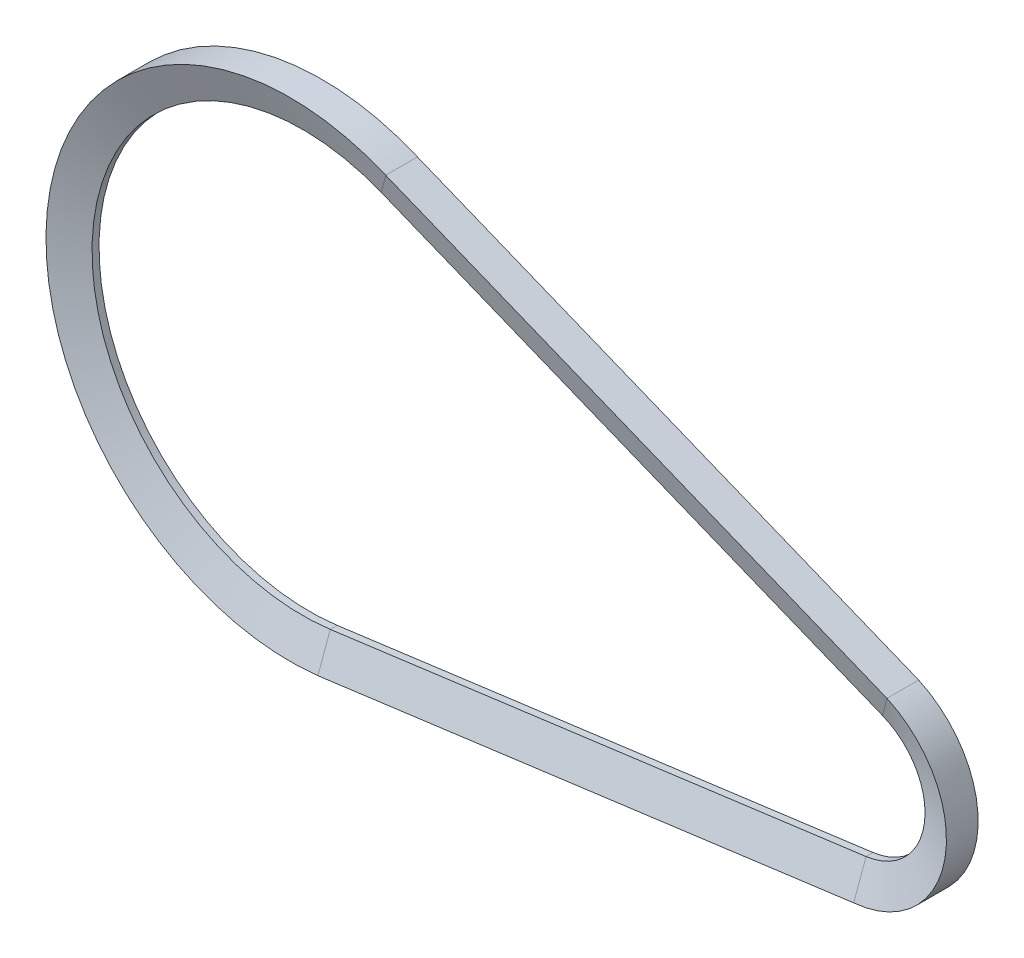
ISO-10303-21;
HEADER;
FILE_DESCRIPTION(('STEP AP214'),'2;1');
FILE_NAME('part.step','',(''),(''),'','','');
FILE_SCHEMA(('AUTOMOTIVE_DESIGN { 1 0 10303 214 1 1 1 1 }'));
ENDSEC;
DATA;
#1=APPLICATION_CONTEXT('core data for automotive mechanical design processes');
#2=APPLICATION_PROTOCOL_DEFINITION('international standard','automotive_design',2000,#1);
#3=PRODUCT_CONTEXT('',#1,'mechanical');
#4=PRODUCT('Part','Part','',(#3));
#5=PRODUCT_RELATED_PRODUCT_CATEGORY('part','',(#4));
#6=PRODUCT_DEFINITION_FORMATION('','',#4);
#7=PRODUCT_DEFINITION_CONTEXT('part definition',#1,'design');
#8=PRODUCT_DEFINITION('design','',#6,#7);
#9=PRODUCT_DEFINITION_SHAPE('','',#8);
#10=(LENGTH_UNIT() NAMED_UNIT(*) SI_UNIT(.MILLI.,.METRE.));
#11=(NAMED_UNIT(*) PLANE_ANGLE_UNIT() SI_UNIT($,.RADIAN.));
#12=(NAMED_UNIT(*) SI_UNIT($,.STERADIAN.) SOLID_ANGLE_UNIT());
#13=UNCERTAINTY_MEASURE_WITH_UNIT(LENGTH_MEASURE(1.E-05),#10,'distance_accuracy_value','');
#14=(GEOMETRIC_REPRESENTATION_CONTEXT(3) GLOBAL_UNCERTAINTY_ASSIGNED_CONTEXT((#13)) GLOBAL_UNIT_ASSIGNED_CONTEXT((#10,
#11,#12)) REPRESENTATION_CONTEXT('',''));
#15=CARTESIAN_POINT('',(0.,0.,0.));
#16=DIRECTION('',(0.,0.,1.));
#17=DIRECTION('',(1.,0.,0.));
#18=AXIS2_PLACEMENT_3D('',#15,#16,#17);
#19=CARTESIAN_POINT('',(124.475719306739,-37.8693151564214,3.49999999999996));
#20=DIRECTION('',(0.131714620449235,-0.991287677094754,0.));
#21=DIRECTION('',(0.991287677094754,0.131714620449235,0.));
#22=AXIS2_PLACEMENT_3D('',#19,#20,#21);
#23=PLANE('',#22);
#24=DIRECTION('',(-0.991287677094754,-0.131714620449235,0.));
#25=VECTOR('',#24,1.);
#26=CARTESIAN_POINT('',(124.475719306739,-37.8693151564214,-3.50000000000004));
#27=LINE('',#26,#25);
#28=CARTESIAN_POINT('',(124.475719306738,-37.8693151564214,-3.50000000000004));
#29=VERTEX_POINT('',#28);
#30=CARTESIAN_POINT('',(6.12472985088943,-53.5948769849061,-3.50000000000004));
#31=VERTEX_POINT('',#30);
#32=EDGE_CURVE('E11',#29,#31,#27,.T.);
#33=ORIENTED_EDGE('',*,*,#32,.F.);
#34=DIRECTION('',(0.,0.,1.));
#35=VECTOR('',#34,1.);
#36=CARTESIAN_POINT('',(124.475719306738,-37.8693151564214,3.49999999999996));
#37=LINE('',#36,#35);
#38=CARTESIAN_POINT('',(124.475719306738,-37.8693151564214,3.49999999999996));
#39=VERTEX_POINT('',#38);
#40=EDGE_CURVE('E35',#29,#39,#37,.T.);
#41=ORIENTED_EDGE('',*,*,#40,.T.);
#42=DIRECTION('',(-0.991287677094754,-0.131714620449235,0.));
#43=VECTOR('',#42,1.);
#44=CARTESIAN_POINT('',(124.475719306739,-37.8693151564214,3.49999999999996));
#45=LINE('',#44,#43);
#46=CARTESIAN_POINT('',(6.12472985088943,-53.5948769849061,3.49999999999996));
#47=VERTEX_POINT('',#46);
#48=EDGE_CURVE('E111',#39,#47,#45,.T.);
#49=ORIENTED_EDGE('',*,*,#48,.T.);
#50=DIRECTION('',(0.,0.,1.));
#51=VECTOR('',#50,1.);
#52=CARTESIAN_POINT('',(6.12472985088943,-53.5948769849061,3.49999999999996));
#53=LINE('',#52,#51);
#54=EDGE_CURVE('E114',#31,#47,#53,.T.);
#55=ORIENTED_EDGE('',*,*,#54,.F.);
#56=EDGE_LOOP('',(#33,#41,#49,#55));
#57=FACE_BOUND('',#56,.T.);
#58=ADVANCED_FACE('F32',(#57),#23,.T.);
#59=CARTESIAN_POINT('',(124.475719306739,-37.8693151564214,-3.50000000000004));
#60=DIRECTION('',(-0.0453981297575221,0.341667511459937,-0.938723772697428));
#61=DIRECTION('',(0.,0.939692620785908,0.342020143325669));
#62=AXIS2_PLACEMENT_3D('',#59,#60,#61);
#63=PLANE('',#62);
#64=DIRECTION('',(-0.991287677094754,-0.131714620449235,0.));
#65=VECTOR('',#64,1.);
#66=CARTESIAN_POINT('',(124.475719306739,-30.3693151564214,-0.770223243003511));
#67=LINE('',#66,#65);
#68=CARTESIAN_POINT('',(124.475719306738,-30.3693151564214,-0.770223243003511));
#69=VERTEX_POINT('',#68);
#70=CARTESIAN_POINT('',(6.12472985088943,-46.0948769849061,-0.770223243003511));
#71=VERTEX_POINT('',#70);
#72=EDGE_CURVE('E40',#69,#71,#67,.T.);
#73=ORIENTED_EDGE('',*,*,#72,.F.);
#74=DIRECTION('',(0.,-0.939692620785908,-0.342020143325669));
#75=VECTOR('',#74,1.);
#76=CARTESIAN_POINT('',(124.475719306738,-37.8693151564214,-3.50000000000004));
#77=LINE('',#76,#75);
#78=EDGE_CURVE('E184',#69,#29,#77,.T.);
#79=ORIENTED_EDGE('',*,*,#78,.T.);
#80=ORIENTED_EDGE('',*,*,#32,.T.);
#81=DIRECTION('',(0.,-0.939692620785908,-0.342020143325669));
#82=VECTOR('',#81,1.);
#83=CARTESIAN_POINT('',(6.12472985088943,-53.5948769849061,-3.50000000000004));
#84=LINE('',#83,#82);
#85=EDGE_CURVE('E138',#71,#31,#84,.T.);
#86=ORIENTED_EDGE('',*,*,#85,.F.);
#87=EDGE_LOOP('',(#73,#79,#80,#86));
#88=FACE_BOUND('',#87,.T.);
#89=ADVANCED_FACE('F223',(#88),#63,.T.);
#90=CARTESIAN_POINT('',(124.475719306739,-30.3693151564214,0.77022324300333));
#91=DIRECTION('',(-0.131714620449235,0.991287677094754,0.));
#92=DIRECTION('',(-0.991287677094754,-0.131714620449235,0.));
#93=AXIS2_PLACEMENT_3D('',#90,#91,#92);
#94=PLANE('',#93);
#95=DIRECTION('',(-0.991287677094754,-0.131714620449235,0.));
#96=VECTOR('',#95,1.);
#97=CARTESIAN_POINT('',(124.475719306739,-30.3693151564214,0.77022324300333));
#98=LINE('',#97,#96);
#99=CARTESIAN_POINT('',(124.475719306738,-30.3693151564214,0.77022324300333));
#100=VERTEX_POINT('',#99);
#101=CARTESIAN_POINT('',(6.12472985088943,-46.0948769849061,0.77022324300333));
#102=VERTEX_POINT('',#101);
#103=EDGE_CURVE('E120',#100,#102,#98,.T.);
#104=ORIENTED_EDGE('',*,*,#103,.F.);
#105=DIRECTION('',(0.,0.,-1.));
#106=VECTOR('',#105,1.);
#107=CARTESIAN_POINT('',(124.475719306738,-30.3693151564214,0.77022324300333));
#108=LINE('',#107,#106);
#109=EDGE_CURVE('E165',#100,#69,#108,.T.);
#110=ORIENTED_EDGE('',*,*,#109,.T.);
#111=ORIENTED_EDGE('',*,*,#72,.T.);
#112=DIRECTION('',(0.,0.,-1.));
#113=VECTOR('',#112,1.);
#114=CARTESIAN_POINT('',(6.12472985088943,-46.0948769849061,0.77022324300333));
#115=LINE('',#114,#113);
#116=EDGE_CURVE('E142',#102,#71,#115,.T.);
#117=ORIENTED_EDGE('',*,*,#116,.F.);
#118=EDGE_LOOP('',(#104,#110,#111,#117));
#119=FACE_BOUND('',#118,.T.);
#120=ADVANCED_FACE('F227',(#119),#94,.T.);
#121=CARTESIAN_POINT('',(122.5,-15.5,0.));
#122=DIRECTION('',(0.,0.,-1.));
#123=DIRECTION('',(-1.,0.,0.));
#124=AXIS2_PLACEMENT_3D('',#121,#122,#123);
#125=CYLINDRICAL_SURFACE('',#124,22.4563961344273);
#126=ORIENTED_EDGE('',*,*,#40,.F.);
#127=CARTESIAN_POINT('',(122.5,-15.5,-3.50000000000004));
#128=DIRECTION('',(0.,0.,-1.));
#129=DIRECTION('',(0.414894040337448,0.90986973534263,0.));
#130=AXIS2_PLACEMENT_3D('',#127,#128,#129);
#131=CIRCLE('',#130,22.4563961344273);
#132=CARTESIAN_POINT('',(131.817024923631,4.93239520758061,-3.50000000000004));
#133=VERTEX_POINT('',#132);
#134=EDGE_CURVE('E193',#133,#29,#131,.T.);
#135=ORIENTED_EDGE('',*,*,#134,.F.);
#136=DIRECTION('',(0.,0.,1.));
#137=VECTOR('',#136,1.);
#138=CARTESIAN_POINT('',(131.817024923631,4.93239520758063,3.49999999999996));
#139=LINE('',#138,#137);
#140=CARTESIAN_POINT('',(131.817024923631,4.93239520758061,3.49999999999996));
#141=VERTEX_POINT('',#140);
#142=EDGE_CURVE('E168',#133,#141,#139,.T.);
#143=ORIENTED_EDGE('',*,*,#142,.T.);
#144=CARTESIAN_POINT('',(122.5,-15.5,3.49999999999996));
#145=DIRECTION('',(0.,0.,-1.));
#146=DIRECTION('',(0.414894040337448,0.90986973534263,0.));
#147=AXIS2_PLACEMENT_3D('',#144,#145,#146);
#148=CIRCLE('',#147,22.4563961344273);
#149=EDGE_CURVE('E162',#141,#39,#148,.T.);
#150=ORIENTED_EDGE('',*,*,#149,.T.);
#151=EDGE_LOOP('',(#126,#135,#143,#150));
#152=FACE_BOUND('',#151,.T.);
#153=ADVANCED_FACE('F200',(#152),#125,.T.);
#154=CARTESIAN_POINT('',(128.117006892717,-1.59139713820364,-0.770223243003511));
#155=CARTESIAN_POINT('',(145.926890042233,-8.78394101937952,-0.770223243003511));
#156=CARTESIAN_POINT('',(143.515788829221,-27.8394183480289,-0.770223243003511));
#157=CARTESIAN_POINT('',(124.475719306739,-30.3693151564214,-0.770223243003511));
#158=CARTESIAN_POINT('',(131.817024923631,4.93239520758063,-3.50000000000004));
#159=CARTESIAN_POINT('',(157.980585327767,-6.9979997314236,-3.50000000000004));
#160=CARTESIAN_POINT('',(153.119494172499,-35.3394183480289,-3.50000000000004));
#161=CARTESIAN_POINT('',(124.475719306739,-37.8693151564214,-3.50000000000004));
#162=(BOUNDED_SURFACE() B_SPLINE_SURFACE(1,3,((#154,#155,#156,#157),(#158,#159,#160,#161)),
.UNSPECIFIED.,.F.,.F.,.F.) B_SPLINE_SURFACE_WITH_KNOTS((2,2),(4,4),(0.,1.),(0.,1.),
.UNSPECIFIED.) GEOMETRIC_REPRESENTATION_ITEM() RATIONAL_B_SPLINE_SURFACE(((1.,0.503405880312619,
0.503405880312619,1.),(1.,0.503405880312619,0.503405880312619,1.))) REPRESENTATION_ITEM('') SURFACE());
#163=CARTESIAN_POINT('',(122.5,-15.5,-0.770223243003511));
#164=DIRECTION('',(0.,0.,-1.));
#165=DIRECTION('',(0.374467126181138,0.927240190786422,0.));
#166=AXIS2_PLACEMENT_3D('',#163,#164,#165);
#167=CIRCLE('',#166,15.);
#168=CARTESIAN_POINT('',(128.117006892717,-1.59139713820367,-0.770223243003511));
#169=VERTEX_POINT('',#168);
#170=EDGE_CURVE('E181',#169,#69,#167,.T.);
#171=DIRECTION('',(0.463583952056587,0.817381270249743,-0.342020143325669));
#172=VECTOR('',#171,1.);
#173=CARTESIAN_POINT('',(131.817024923631,4.93239520758063,-3.50000000000004));
#174=LINE('',#173,#172);
#175=EDGE_CURVE('E177',#169,#133,#174,.T.);
#176=ORIENTED_EDGE('',*,*,#134,.T.);
#177=ORIENTED_EDGE('',*,*,#78,.F.);
#178=ORIENTED_EDGE('',*,*,#170,.F.);
#179=ORIENTED_EDGE('',*,*,#175,.T.);
#180=EDGE_LOOP('',(#176,#177,#178,#179));
#181=FACE_BOUND('',#180,.T.);
#182=ADVANCED_FACE('F236',(#181),#162,.T.);
#183=CARTESIAN_POINT('',(122.5,-15.5,0.));
#184=DIRECTION('',(0.,0.,-1.));
#185=DIRECTION('',(-1.,0.,0.));
#186=AXIS2_PLACEMENT_3D('',#183,#184,#185);
#187=CYLINDRICAL_SURFACE('',#186,15.);
#188=ORIENTED_EDGE('',*,*,#170,.T.);
#189=ORIENTED_EDGE('',*,*,#109,.F.);
#190=CARTESIAN_POINT('',(122.5,-15.5,0.77022324300333));
#191=DIRECTION('',(0.,0.,-1.));
#192=DIRECTION('',(0.374467126181138,0.927240190786422,0.));
#193=AXIS2_PLACEMENT_3D('',#190,#191,#192);
#194=CIRCLE('',#193,15.);
#195=CARTESIAN_POINT('',(128.117006892717,-1.59139713820367,0.77022324300333));
#196=VERTEX_POINT('',#195);
#197=EDGE_CURVE('E161',#196,#100,#194,.T.);
#198=ORIENTED_EDGE('',*,*,#197,.F.);
#199=DIRECTION('',(0.,0.,-1.));
#200=VECTOR('',#199,1.);
#201=CARTESIAN_POINT('',(128.117006892717,-1.59139713820365,0.77022324300333));
#202=LINE('',#201,#200);
#203=EDGE_CURVE('E154',#196,#169,#202,.T.);
#204=ORIENTED_EDGE('',*,*,#203,.T.);
#205=EDGE_LOOP('',(#188,#189,#198,#204));
#206=FACE_BOUND('',#205,.T.);
#207=ADVANCED_FACE('F208',(#206),#187,.F.);
#208=CARTESIAN_POINT('',(131.817024923631,4.93239520758063,3.49999999999996));
#209=CARTESIAN_POINT('',(157.980585327767,-6.9979997314236,3.49999999999996));
#210=CARTESIAN_POINT('',(153.119494172499,-35.3394183480289,3.49999999999996));
#211=CARTESIAN_POINT('',(124.475719306739,-37.8693151564214,3.49999999999996));
#212=CARTESIAN_POINT('',(128.117006892717,-1.59139713820364,0.770223243003331));
#213=CARTESIAN_POINT('',(145.926890042233,-8.78394101937952,0.770223243003331));
#214=CARTESIAN_POINT('',(143.515788829221,-27.8394183480289,0.770223243003331));
#215=CARTESIAN_POINT('',(124.475719306739,-30.3693151564214,0.770223243003331));
#216=(BOUNDED_SURFACE() B_SPLINE_SURFACE(1,3,((#208,#209,#210,#211),(#212,#213,#214,#215)),
.UNSPECIFIED.,.F.,.F.,.F.) B_SPLINE_SURFACE_WITH_KNOTS((2,2),(4,4),(0.,1.),(0.,1.),
.UNSPECIFIED.) GEOMETRIC_REPRESENTATION_ITEM() RATIONAL_B_SPLINE_SURFACE(((1.,0.503405880312619,
0.503405880312619,1.),(1.,0.503405880312619,0.503405880312619,1.))) REPRESENTATION_ITEM('') SURFACE());
#217=DIRECTION('',(0.,0.939692620785904,-0.342020143325681));
#218=VECTOR('',#217,1.);
#219=CARTESIAN_POINT('',(124.475719306738,-37.8693151564214,3.49999999999996));
#220=LINE('',#219,#218);
#221=EDGE_CURVE('E159',#39,#100,#220,.T.);
#222=DIRECTION('',(-0.463583952056585,-0.817381270249739,-0.342020143325681));
#223=VECTOR('',#222,1.);
#224=CARTESIAN_POINT('',(131.817024923631,4.93239520758063,3.49999999999996));
#225=LINE('',#224,#223);
#226=EDGE_CURVE('E151',#141,#196,#225,.T.);
#227=ORIENTED_EDGE('',*,*,#197,.T.);
#228=ORIENTED_EDGE('',*,*,#221,.F.);
#229=ORIENTED_EDGE('',*,*,#149,.F.);
#230=ORIENTED_EDGE('',*,*,#226,.T.);
#231=EDGE_LOOP('',(#227,#228,#229,#230));
#232=FACE_BOUND('',#231,.T.);
#233=ADVANCED_FACE('F205',(#232),#216,.T.);
#234=CARTESIAN_POINT('',(21.1127393983367,49.6404612173529,3.49999999999996));
#235=DIRECTION('',(0.374467126181139,0.927240190786421,0.));
#236=DIRECTION('',(-0.927240190786421,0.374467126181139,0.));
#237=AXIS2_PLACEMENT_3D('',#234,#235,#236);
#238=PLANE('',#237);
#239=ORIENTED_EDGE('',*,*,#142,.F.);
#240=DIRECTION('',(0.927240190786421,-0.374467126181139,0.));
#241=VECTOR('',#240,1.);
#242=CARTESIAN_POINT('',(21.1127393983367,49.6404612173529,-3.50000000000004));
#243=LINE('',#242,#241);
#244=CARTESIAN_POINT('',(21.1127393983366,49.6404612173529,-3.50000000000004));
#245=VERTEX_POINT('',#244);
#246=EDGE_CURVE('E76',#245,#133,#243,.T.);
#247=ORIENTED_EDGE('',*,*,#246,.F.);
#248=DIRECTION('',(0.,0.,1.));
#249=VECTOR('',#248,1.);
#250=CARTESIAN_POINT('',(21.1127393983366,49.6404612173529,3.49999999999996));
#251=LINE('',#250,#249);
#252=CARTESIAN_POINT('',(21.1127393983366,49.6404612173529,3.49999999999996));
#253=VERTEX_POINT('',#252);
#254=EDGE_CURVE('E158',#245,#253,#251,.T.);
#255=ORIENTED_EDGE('',*,*,#254,.T.);
#256=DIRECTION('',(0.927240190786421,-0.374467126181139,0.));
#257=VECTOR('',#256,1.);
#258=CARTESIAN_POINT('',(21.1127393983367,49.6404612173529,3.49999999999996));
#259=LINE('',#258,#257);
#260=EDGE_CURVE('E156',#253,#141,#259,.T.);
#261=ORIENTED_EDGE('',*,*,#260,.T.);
#262=EDGE_LOOP('',(#239,#247,#255,#261));
#263=FACE_BOUND('',#262,.T.);
#264=ADVANCED_FACE('F218',(#263),#238,.T.);
#265=CARTESIAN_POINT('',(21.1127393983367,49.6404612173529,-3.50000000000004));
#266=DIRECTION('',(-0.129067730873885,-0.319592239298412,-0.938723772697428));
#267=DIRECTION('',(0.,0.946641691748173,-0.322287926308383));
#268=AXIS2_PLACEMENT_3D('',#265,#266,#267);
#269=PLANE('',#268);
#270=ORIENTED_EDGE('',*,*,#246,.T.);
#271=ORIENTED_EDGE('',*,*,#175,.F.);
#272=DIRECTION('',(0.927240190786421,-0.374467126181139,0.));
#273=VECTOR('',#272,1.);
#274=CARTESIAN_POINT('',(17.412721367423,43.1166688715686,-0.770223243003511));
#275=LINE('',#274,#273);
#276=CARTESIAN_POINT('',(17.4127213674229,43.1166688715686,-0.770223243003511));
#277=VERTEX_POINT('',#276);
#278=EDGE_CURVE('E86',#277,#169,#275,.T.);
#279=ORIENTED_EDGE('',*,*,#278,.F.);
#280=DIRECTION('',(0.463583952056587,0.817381270249743,-0.342020143325669));
#281=VECTOR('',#280,1.);
#282=CARTESIAN_POINT('',(21.1127393983366,49.6404612173529,-3.50000000000004));
#283=LINE('',#282,#281);
#284=EDGE_CURVE('E174',#277,#245,#283,.T.);
#285=ORIENTED_EDGE('',*,*,#284,.T.);
#286=EDGE_LOOP('',(#270,#271,#279,#285));
#287=FACE_BOUND('',#286,.T.);
#288=ADVANCED_FACE('F211',(#287),#269,.T.);
#289=CARTESIAN_POINT('',(17.412721367423,43.1166688715686,0.77022324300333));
#290=DIRECTION('',(-0.374467126181139,-0.927240190786421,0.));
#291=DIRECTION('',(0.927240190786421,-0.374467126181139,0.));
#292=AXIS2_PLACEMENT_3D('',#289,#290,#291);
#293=PLANE('',#292);
#294=ORIENTED_EDGE('',*,*,#278,.T.);
#295=ORIENTED_EDGE('',*,*,#203,.F.);
#296=DIRECTION('',(0.927240190786421,-0.374467126181139,0.));
#297=VECTOR('',#296,1.);
#298=CARTESIAN_POINT('',(17.412721367423,43.1166688715686,0.77022324300333));
#299=LINE('',#298,#297);
#300=CARTESIAN_POINT('',(17.4127213674229,43.1166688715686,0.77022324300333));
#301=VERTEX_POINT('',#300);
#302=EDGE_CURVE('E94',#301,#196,#299,.T.);
#303=ORIENTED_EDGE('',*,*,#302,.F.);
#304=DIRECTION('',(0.,0.,-1.));
#305=VECTOR('',#304,1.);
#306=CARTESIAN_POINT('',(17.412721367423,43.1166688715686,0.77022324300333));
#307=LINE('',#306,#305);
#308=EDGE_CURVE('E149',#301,#277,#307,.T.);
#309=ORIENTED_EDGE('',*,*,#308,.T.);
#310=EDGE_LOOP('',(#294,#295,#303,#309));
#311=FACE_BOUND('',#310,.T.);
#312=ADVANCED_FACE('F209',(#311),#293,.T.);
#313=CARTESIAN_POINT('',(21.1127393983367,49.6404612173529,3.49999999999996));
#314=DIRECTION('',(-0.129067730873889,-0.319592239298423,0.938723772697424));
#315=DIRECTION('',(0.,-0.946641691748169,-0.322287926308394));
#316=AXIS2_PLACEMENT_3D('',#313,#314,#315);
#317=PLANE('',#316);
#318=ORIENTED_EDGE('',*,*,#302,.T.);
#319=ORIENTED_EDGE('',*,*,#226,.F.);
#320=ORIENTED_EDGE('',*,*,#260,.F.);
#321=DIRECTION('',(-0.463583952056585,-0.81738127024974,-0.342020143325681));
#322=VECTOR('',#321,1.);
#323=CARTESIAN_POINT('',(21.1127393983366,49.6404612173529,3.49999999999996));
#324=LINE('',#323,#322);
#325=EDGE_CURVE('E130',#253,#301,#324,.T.);
#326=ORIENTED_EDGE('',*,*,#325,.T.);
#327=EDGE_LOOP('',(#318,#319,#320,#326));
#328=FACE_BOUND('',#327,.T.);
#329=ADVANCED_FACE('F203',(#328),#317,.T.);
#330=CARTESIAN_POINT('',(0.,0.,0.));
#331=DIRECTION('',(0.,0.,-1.));
#332=DIRECTION('',(-1.,0.,0.));
#333=AXIS2_PLACEMENT_3D('',#330,#331,#332);
#334=CYLINDRICAL_SURFACE('',#333,53.9437035693101);
#335=ORIENTED_EDGE('',*,*,#254,.F.);
#336=CARTESIAN_POINT('',(0.,0.,-3.50000000000004));
#337=DIRECTION('',(0.,0.,-1.));
#338=DIRECTION('',(0.113539290883504,-0.993533506946631,0.));
#339=AXIS2_PLACEMENT_3D('',#336,#337,#338);
#340=CIRCLE('',#339,53.9437035693101);
#341=EDGE_CURVE('E137',#31,#245,#340,.T.);
#342=ORIENTED_EDGE('',*,*,#341,.F.);
#343=ORIENTED_EDGE('',*,*,#54,.T.);
#344=CARTESIAN_POINT('',(0.,0.,3.49999999999996));
#345=DIRECTION('',(0.,0.,-1.));
#346=DIRECTION('',(0.113539290883504,-0.993533506946631,0.));
#347=AXIS2_PLACEMENT_3D('',#344,#345,#346);
#348=CIRCLE('',#347,53.9437035693101);
#349=EDGE_CURVE('E126',#47,#253,#348,.T.);
#350=ORIENTED_EDGE('',*,*,#349,.T.);
#351=EDGE_LOOP('',(#335,#342,#343,#350));
#352=FACE_BOUND('',#351,.T.);
#353=ADVANCED_FACE('F135',(#352),#334,.T.);
#354=CARTESIAN_POINT('',(6.12472985088943,-46.0948769849061,-0.770223243003511));
#355=CARTESIAN_POINT('',(-26.763809279918,-50.4648510588702,-0.770223243003511));
#356=CARTESIAN_POINT('',(-50.2969528979131,-27.0780207687135,-0.770223243003511));
#357=CARTESIAN_POINT('',(-46.1321783681313,5.8371327731105,-0.770223243003511));
#358=CARTESIAN_POINT('',(-41.9674038383495,38.7522863149345,-0.770223243003511));
#359=CARTESIAN_POINT('',(-13.3508763277611,55.5405867888214,-0.770223243003511));
#360=CARTESIAN_POINT('',(17.412721367423,43.1166688715686,-0.770223243003511));
#361=CARTESIAN_POINT('',(6.12472985088943,-53.5948769849061,-3.50000000000004));
#362=CARTESIAN_POINT('',(-32.1150339629089,-57.9648510588702,-3.50000000000004));
#363=CARTESIAN_POINT('',(-58.9139401287493,-30.3388698408813,-3.50000000000004));
#364=CARTESIAN_POINT('',(-53.3840209820255,7.75044892662746,-3.50000000000004));
#365=CARTESIAN_POINT('',(-47.8541018353016,45.8397676941362,-3.50000000000004));
#366=CARTESIAN_POINT('',(-14.3055621138431,64.7043295098772,-3.50000000000004));
#367=CARTESIAN_POINT('',(21.1127393983367,49.6404612173529,-3.50000000000004));
#368=(BOUNDED_SURFACE() B_SPLINE_SURFACE(1,3,((#354,#355,#356,#357,#358,#359,#360),(#361,#362,
#363,#364,#365,#366,#367)),.UNSPECIFIED.,.F.,.F.,.F.) B_SPLINE_SURFACE_WITH_KNOTS((2,2),(4,3,4),
(0.,1.),(0.,0.5,1.),
.UNSPECIFIED.) GEOMETRIC_REPRESENTATION_ITEM() RATIONAL_B_SPLINE_SURFACE(((1.,0.740188803038642,
0.740188803038642,1.,0.740188803038642,0.740188803038642,1.),(1.,0.740188803038642,
0.740188803038642,1.,0.740188803038642,0.740188803038642,1.))) REPRESENTATION_ITEM('') SURFACE());
#369=CARTESIAN_POINT('',(0.,0.,-0.770223243003511));
#370=DIRECTION('',(0.,0.,-1.));
#371=DIRECTION('',(0.131714620449235,-0.991287677094754,0.));
#372=AXIS2_PLACEMENT_3D('',#369,#370,#371);
#373=CIRCLE('',#372,46.5);
#374=EDGE_CURVE('E171',#71,#277,#373,.T.);
#375=ORIENTED_EDGE('',*,*,#341,.T.);
#376=ORIENTED_EDGE('',*,*,#284,.F.);
#377=ORIENTED_EDGE('',*,*,#374,.F.);
#378=ORIENTED_EDGE('',*,*,#85,.T.);
#379=EDGE_LOOP('',(#375,#376,#377,#378));
#380=FACE_BOUND('',#379,.T.);
#381=ADVANCED_FACE('F241',(#380),#368,.T.);
#382=CARTESIAN_POINT('',(0.,0.,0.));
#383=DIRECTION('',(0.,0.,-1.));
#384=DIRECTION('',(-1.,0.,0.));
#385=AXIS2_PLACEMENT_3D('',#382,#383,#384);
#386=CYLINDRICAL_SURFACE('',#385,46.5);
#387=ORIENTED_EDGE('',*,*,#374,.T.);
#388=ORIENTED_EDGE('',*,*,#308,.F.);
#389=CARTESIAN_POINT('',(0.,0.,0.77022324300333));
#390=DIRECTION('',(0.,0.,-1.));
#391=DIRECTION('',(0.131714620449235,-0.991287677094754,0.));
#392=AXIS2_PLACEMENT_3D('',#389,#390,#391);
#393=CIRCLE('',#392,46.5);
#394=EDGE_CURVE('E148',#102,#301,#393,.T.);
#395=ORIENTED_EDGE('',*,*,#394,.F.);
#396=ORIENTED_EDGE('',*,*,#116,.T.);
#397=EDGE_LOOP('',(#387,#388,#395,#396));
#398=FACE_BOUND('',#397,.T.);
#399=ADVANCED_FACE('F255',(#398),#386,.F.);
#400=CARTESIAN_POINT('',(6.12472985088943,-53.5948769849061,3.49999999999996));
#401=CARTESIAN_POINT('',(-32.1150339629089,-57.9648510588702,3.49999999999996));
#402=CARTESIAN_POINT('',(-58.9139401287493,-30.3388698408813,3.49999999999996));
#403=CARTESIAN_POINT('',(-53.3840209820255,7.75044892662746,3.49999999999996));
#404=CARTESIAN_POINT('',(-47.8541018353016,45.8397676941362,3.49999999999996));
#405=CARTESIAN_POINT('',(-14.3055621138431,64.7043295098772,3.49999999999996));
#406=CARTESIAN_POINT('',(21.1127393983367,49.6404612173529,3.49999999999996));
#407=CARTESIAN_POINT('',(6.12472985088943,-46.0948769849061,0.770223243003331));
#408=CARTESIAN_POINT('',(-26.763809279918,-50.4648510588702,0.770223243003331));
#409=CARTESIAN_POINT('',(-50.2969528979131,-27.0780207687135,0.770223243003331));
#410=CARTESIAN_POINT('',(-46.1321783681313,5.8371327731105,0.770223243003331));
#411=CARTESIAN_POINT('',(-41.9674038383495,38.7522863149345,0.770223243003331));
#412=CARTESIAN_POINT('',(-13.3508763277611,55.5405867888214,0.770223243003331));
#413=CARTESIAN_POINT('',(17.412721367423,43.1166688715686,0.770223243003331));
#414=(BOUNDED_SURFACE() B_SPLINE_SURFACE(1,3,((#400,#401,#402,#403,#404,#405,#406),(#407,#408,
#409,#410,#411,#412,#413)),.UNSPECIFIED.,.F.,.F.,.F.) B_SPLINE_SURFACE_WITH_KNOTS((2,2),(4,3,4),
(0.,1.),(0.,0.5,1.),
.UNSPECIFIED.) GEOMETRIC_REPRESENTATION_ITEM() RATIONAL_B_SPLINE_SURFACE(((1.,0.740188803038642,
0.740188803038642,1.,0.740188803038642,0.740188803038642,1.),(1.,0.740188803038642,
0.740188803038642,1.,0.740188803038642,0.740188803038642,1.))) REPRESENTATION_ITEM('') SURFACE());
#415=DIRECTION('',(0.,0.939692620785904,-0.342020143325681));
#416=VECTOR('',#415,1.);
#417=CARTESIAN_POINT('',(6.12472985088943,-53.5948769849061,3.49999999999996));
#418=LINE('',#417,#416);
#419=EDGE_CURVE('E129',#47,#102,#418,.T.);
#420=ORIENTED_EDGE('',*,*,#394,.T.);
#421=ORIENTED_EDGE('',*,*,#325,.F.);
#422=ORIENTED_EDGE('',*,*,#349,.F.);
#423=ORIENTED_EDGE('',*,*,#419,.T.);
#424=EDGE_LOOP('',(#420,#421,#422,#423));
#425=FACE_BOUND('',#424,.T.);
#426=ADVANCED_FACE('F128',(#425),#414,.T.);
#427=CARTESIAN_POINT('',(124.475719306739,-37.8693151564214,3.49999999999996));
#428=DIRECTION('',(-0.0453981297575237,0.341667511459949,0.938723772697424));
#429=DIRECTION('',(0.,-0.939692620785904,0.342020143325681));
#430=AXIS2_PLACEMENT_3D('',#427,#428,#429);
#431=PLANE('',#430);
#432=ORIENTED_EDGE('',*,*,#221,.T.);
#433=ORIENTED_EDGE('',*,*,#103,.T.);
#434=ORIENTED_EDGE('',*,*,#419,.F.);
#435=ORIENTED_EDGE('',*,*,#48,.F.);
#436=EDGE_LOOP('',(#432,#433,#434,#435));
#437=FACE_BOUND('',#436,.T.);
#438=ADVANCED_FACE('F140',(#437),#431,.T.);
#439=CLOSED_SHELL('',(#58,#89,#120,#153,#182,#207,#233,#264,#288,#312,#329,#353,#381,#399,#426,#438));
#440=MANIFOLD_SOLID_BREP('B2',#439);
#441=ADVANCED_BREP_SHAPE_REPRESENTATION('',(#18,#440),#14);
#442=SHAPE_DEFINITION_REPRESENTATION(#9,#441);
ENDSEC;
END-ISO-10303-21;
